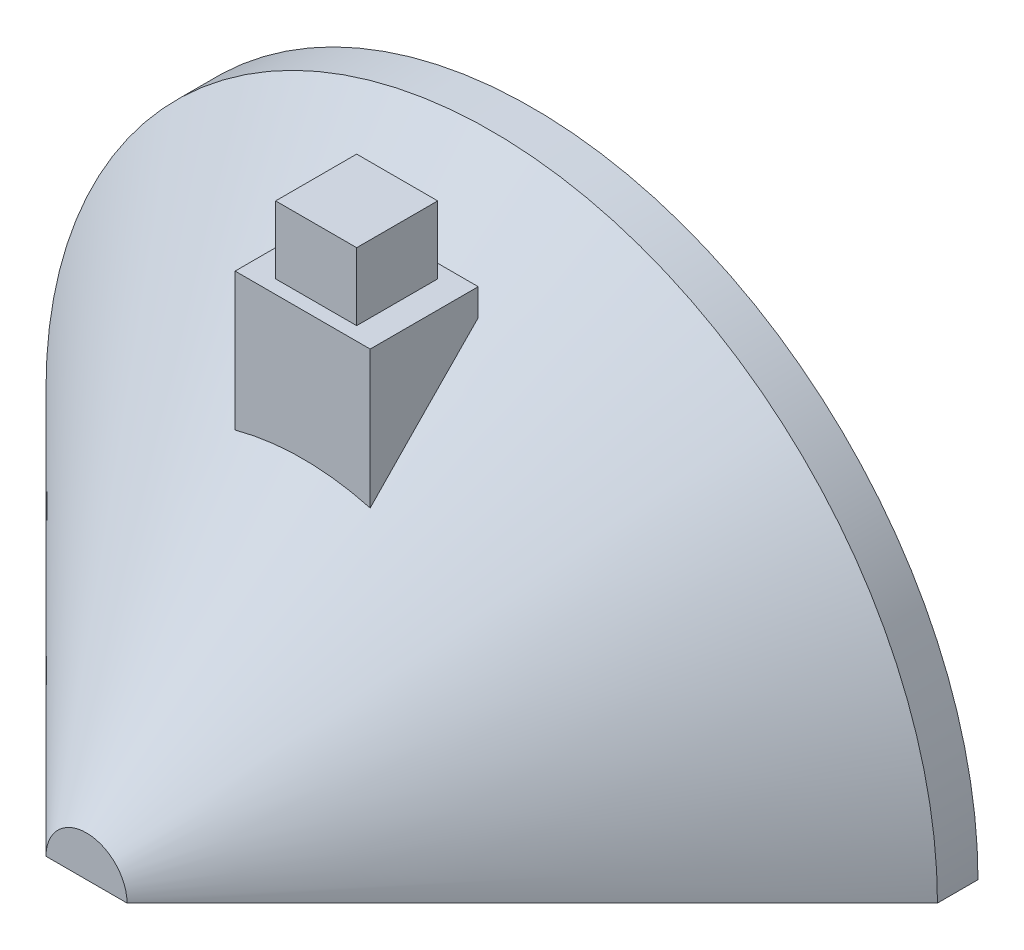
ISO-10303-21;
HEADER;
FILE_DESCRIPTION(('STEP AP214'),'2;1');
FILE_NAME('part.step','',(''),(''),'','','');
FILE_SCHEMA(('AUTOMOTIVE_DESIGN { 1 0 10303 214 1 1 1 1 }'));
ENDSEC;
DATA;
#1=APPLICATION_CONTEXT('core data for automotive mechanical design processes');
#2=APPLICATION_PROTOCOL_DEFINITION('international standard','automotive_design',2000,#1);
#3=PRODUCT_CONTEXT('',#1,'mechanical');
#4=PRODUCT('Part','Part','',(#3));
#5=PRODUCT_RELATED_PRODUCT_CATEGORY('part','',(#4));
#6=PRODUCT_DEFINITION_FORMATION('','',#4);
#7=PRODUCT_DEFINITION_CONTEXT('part definition',#1,'design');
#8=PRODUCT_DEFINITION('design','',#6,#7);
#9=PRODUCT_DEFINITION_SHAPE('','',#8);
#10=(LENGTH_UNIT() NAMED_UNIT(*) SI_UNIT(.MILLI.,.METRE.));
#11=(NAMED_UNIT(*) PLANE_ANGLE_UNIT() SI_UNIT($,.RADIAN.));
#12=(NAMED_UNIT(*) SI_UNIT($,.STERADIAN.) SOLID_ANGLE_UNIT());
#13=UNCERTAINTY_MEASURE_WITH_UNIT(LENGTH_MEASURE(1.E-05),#10,'distance_accuracy_value','');
#14=(GEOMETRIC_REPRESENTATION_CONTEXT(3) GLOBAL_UNCERTAINTY_ASSIGNED_CONTEXT((#13)) GLOBAL_UNIT_ASSIGNED_CONTEXT((#10,
#11,#12)) REPRESENTATION_CONTEXT('',''));
#15=CARTESIAN_POINT('',(0.,0.,0.));
#16=DIRECTION('',(0.,0.,1.));
#17=DIRECTION('',(1.,0.,0.));
#18=AXIS2_PLACEMENT_3D('',#15,#16,#17);
#19=CARTESIAN_POINT('',(0.,0.,-38.1));
#20=DIRECTION('',(0.,0.,-1.));
#21=DIRECTION('',(-1.,0.,0.));
#22=AXIS2_PLACEMENT_3D('',#19,#20,#21);
#23=CONICAL_SURFACE('',#22,41.91,0.785398163397448);
#24=CARTESIAN_POINT('',(0.,0.,-38.1));
#25=DIRECTION('',(0.,0.,-1.));
#26=DIRECTION('',(-1.,0.,0.));
#27=AXIS2_PLACEMENT_3D('',#24,#25,#26);
#28=CIRCLE('',#27,41.91);
#29=CARTESIAN_POINT('',(-41.91,-1.46327982910916E-13,-38.1));
#30=VERTEX_POINT('',#29);
#31=CARTESIAN_POINT('',(41.91,-1.46327982910916E-13,-38.1));
#32=VERTEX_POINT('',#31);
#33=EDGE_CURVE('E243',#30,#32,#28,.T.);
#34=ORIENTED_EDGE('',*,*,#33,.F.);
#35=DIRECTION('',(0.707106781186547,0.,0.707106781186547));
#36=VECTOR('',#35,1.);
#37=CARTESIAN_POINT('',(-41.91,-1.46327982910916E-13,-38.1));
#38=LINE('',#37,#36);
#39=CARTESIAN_POINT('',(-3.81,0.,0.));
#40=VERTEX_POINT('',#39);
#41=EDGE_CURVE('E230',#30,#40,#38,.T.);
#42=ORIENTED_EDGE('',*,*,#41,.T.);
#43=CARTESIAN_POINT('',(0.,0.,0.));
#44=DIRECTION('',(0.,0.,-1.));
#45=DIRECTION('',(-1.,0.,0.));
#46=AXIS2_PLACEMENT_3D('',#43,#44,#45);
#47=CIRCLE('',#46,3.81);
#48=CARTESIAN_POINT('',(3.81,0.,0.));
#49=VERTEX_POINT('',#48);
#50=EDGE_CURVE('E246',#40,#49,#47,.T.);
#51=ORIENTED_EDGE('',*,*,#50,.T.);
#52=DIRECTION('',(-0.707106781186547,0.,0.707106781186547));
#53=VECTOR('',#52,1.);
#54=CARTESIAN_POINT('',(41.91,-1.46327982910916E-13,-38.1));
#55=LINE('',#54,#53);
#56=EDGE_CURVE('E214',#32,#49,#55,.T.);
#57=ORIENTED_EDGE('',*,*,#56,.F.);
#58=EDGE_LOOP('',(#34,#42,#51,#57));
#59=FACE_BOUND('',#58,.T.);
#60=CARTESIAN_POINT('',(0.,0.,-20.32));
#61=DIRECTION('',(0.,0.,1.));
#62=DIRECTION('',(1.,0.,0.));
#63=AXIS2_PLACEMENT_3D('',#60,#61,#62);
#64=CIRCLE('',#63,24.13);
#65=CARTESIAN_POINT('',(-6.35,23.2794845303757,-20.32));
#66=VERTEX_POINT('',#65);
#67=CARTESIAN_POINT('',(6.35,23.2794845303757,-20.32));
#68=VERTEX_POINT('',#67);
#69=EDGE_CURVE('E61',#66,#68,#64,.F.);
#70=ORIENTED_EDGE('',*,*,#69,.F.);
#71=CARTESIAN_POINT('',(-6.35,1.44781831739966,-2.70296229685064));
#72=CARTESIAN_POINT('',(-6.35,1.70063037380408,-2.7591551997417));
#73=CARTESIAN_POINT('',(-6.35,1.95003338328599,-2.82861011091205));
#74=CARTESIAN_POINT('',(-6.35,2.4409831839826,-2.98906178464041));
#75=CARTESIAN_POINT('',(-6.35,2.68255286715164,-3.07998782526395));
#76=CARTESIAN_POINT('',(-6.35,3.15622279339293,-3.27789822967199));
#77=CARTESIAN_POINT('',(-6.35,3.38839037570752,-3.38472479079187));
#78=CARTESIAN_POINT('',(-6.35,3.73185997589738,-3.55474049026421));
#79=CARTESIAN_POINT('',(-6.35,3.84560404840172,-3.61307075444828));
#80=CARTESIAN_POINT('',(-6.35,4.07156775468318,-3.7326102977887));
#81=CARTESIAN_POINT('',(-6.35,4.18378740795518,-3.79381954008277));
#82=CARTESIAN_POINT('',(-6.35,4.51709068598885,-3.98055878221523));
#83=CARTESIAN_POINT('',(-6.35,4.73607930291173,-4.10983343301281));
#84=CARTESIAN_POINT('',(-6.35,5.16924646821573,-4.37623618799389));
#85=CARTESIAN_POINT('',(-6.35,5.38342400213568,-4.51336592725184));
#86=CARTESIAN_POINT('',(-6.35,5.80781886297028,-4.79394682052826));
#87=CARTESIAN_POINT('',(-6.35,6.01803303615147,-4.93740272851396));
#88=CARTESIAN_POINT('',(-6.35,6.43494096477158,-5.22929346457439));
#89=CARTESIAN_POINT('',(-6.35,6.64163496407014,-5.37772794562627));
#90=CARTESIAN_POINT('',(-6.35,7.05253177172607,-5.67900095619633));
#91=CARTESIAN_POINT('',(-6.35,7.25672754578679,-5.83184905669594));
#92=CARTESIAN_POINT('',(-6.35,7.66257341653958,-6.14089299760288));
#93=CARTESIAN_POINT('',(-6.35,7.86422343538842,-6.2970889399873));
#94=CARTESIAN_POINT('',(-6.35,8.46574808382686,-6.76967816041233));
#95=CARTESIAN_POINT('',(-6.35,8.86237497896674,-7.09020468542234));
#96=CARTESIAN_POINT('',(-6.35,9.66071623783298,-7.74853253247813));
#97=CARTESIAN_POINT('',(-6.35,10.0622389371087,-8.08656481835487));
#98=CARTESIAN_POINT('',(-6.35,10.8601698037552,-8.76867139108604));
#99=CARTESIAN_POINT('',(-6.35,11.2565775100933,-9.11274621606782));
#100=CARTESIAN_POINT('',(-6.35,12.0447560974404,-9.80481485592122));
#101=CARTESIAN_POINT('',(-6.35,12.4365337154975,-10.1528010140359));
#102=CARTESIAN_POINT('',(-6.35,13.0218610539503,-10.6773709306655));
#103=CARTESIAN_POINT('',(-6.35,13.2165770309706,-10.8526563499511));
#104=CARTESIAN_POINT('',(-6.35,13.6053127394153,-11.2039972830734));
#105=CARTESIAN_POINT('',(-6.35,13.7993324714562,-11.3800527962279));
#106=CARTESIAN_POINT('',(-6.35,14.4373992434899,-11.961087321857));
#107=CARTESIAN_POINT('',(-6.35,14.8801263802326,-12.3675161861072));
#108=CARTESIAN_POINT('',(-6.35,15.7630238398576,-13.1831433703615));
#109=CARTESIAN_POINT('',(-6.35,16.2031941450579,-13.592341709476));
#110=CARTESIAN_POINT('',(-6.35,17.0814961564063,-14.4129387576574));
#111=CARTESIAN_POINT('',(-6.35,17.5196278170729,-14.8243375153788));
#112=CARTESIAN_POINT('',(-6.35,18.3942259270049,-15.6489019209196));
#113=CARTESIAN_POINT('',(-6.35,18.8306923727436,-16.0620675724771));
#114=CARTESIAN_POINT('',(-6.35,20.1381320282824,-17.303786600433));
#115=CARTESIAN_POINT('',(-6.35,21.0070657107407,-18.1344872094059));
#116=CARTESIAN_POINT('',(-6.35,22.7411315871325,-19.7998184795611));
#117=CARTESIAN_POINT('',(-6.35,23.6062638289205,-20.634449090995));
#118=CARTESIAN_POINT('',(-6.35,25.3346277653886,-22.3074028337558));
#119=CARTESIAN_POINT('',(-6.35,26.197856690522,-23.1457288251256));
#120=CARTESIAN_POINT('',(-6.35,27.9222418801036,-24.8245137475987));
#121=CARTESIAN_POINT('',(-6.35,28.7833981383792,-25.6649726850388));
#122=CARTESIAN_POINT('',(-6.35,30.5040714212876,-27.3474777571352));
#123=CARTESIAN_POINT('',(-6.35,31.3635885281666,-28.1895238077032));
#124=CARTESIAN_POINT('',(-6.35,33.0813696912763,-29.874893217233));
#125=CARTESIAN_POINT('',(-6.35,33.9396337471466,-30.7182165765618));
#126=CARTESIAN_POINT('',(-6.35,36.3010414980101,-33.0412530462178));
#127=CARTESIAN_POINT('',(-6.35,37.8031545475805,-34.5220137360672));
#128=CARTESIAN_POINT('',(-6.35,40.8052744547021,-37.4857145387342));
#129=CARTESIAN_POINT('',(-6.35,42.3052812789386,-38.968654685282));
#130=CARTESIAN_POINT('',(-6.35,45.3020065444127,-41.9343755399805));
#131=CARTESIAN_POINT('',(-6.35,46.79872678154,-43.4171544338092));
#132=CARTESIAN_POINT('',(-6.35,49.7909607291435,-46.3838788872956));
#133=CARTESIAN_POINT('',(-6.35,51.2864744594904,-47.86782442691));
#134=CARTESIAN_POINT('',(-6.35,52.7815788059982,-49.3521816826003));
#135=B_SPLINE_CURVE_WITH_KNOTS('',3,(#71,#72,#73,#74,#75,#76,#77,#78,#79,#80,#81,#82,#83,#84,
#85,#86,#87,#88,#89,#90,#91,#92,#93,#94,#95,#96,#97,#98,#99,#100,#101,#102,#103,#104,#105,#106,
#107,#108,#109,#110,#111,#112,#113,#114,#115,#116,#117,#118,#119,#120,#121,#122,#123,#124,#125,
#126,#127,#128,#129,#130,#131,#132,#133,#134),.UNSPECIFIED.,.F.,.F.,(4,2,2,2,2,2,2,2,2,2,2,2,2,
2,2,2,2,2,2,2,2,2,2,2,2,2,2,2,2,2,2,4),(0.,0.775935212391134,1.54934943621371,2.31554493939615,
2.69899526635419,3.08244068497131,3.84510371017097,4.60792606833788,5.37133177800353,
6.13468438592507,6.89983936097022,7.66501767626798,9.19471080441795,10.7692430673752,
12.3439162709665,13.9159124998383,14.7018839128065,15.4878546297043,17.2908141334618,
19.0937860909718,20.8967980810422,22.6998138875275,26.306173804161,29.9124881913216,
33.5224127332208,37.1323480125208,40.74209712462,44.3518472742557,50.6796365614786,
57.0075248344417,63.3280653814893,69.6484996150279),.UNSPECIFIED.);
#136=CARTESIAN_POINT('',(-6.35,33.6969078700109,-30.48));
#137=VERTEX_POINT('',#136);
#138=EDGE_CURVE('E11',#66,#137,#135,.T.);
#139=ORIENTED_EDGE('',*,*,#138,.T.);
#140=CARTESIAN_POINT('',(0.,0.,-30.48));
#141=DIRECTION('',(0.,0.,-1.));
#142=DIRECTION('',(-1.,0.,0.));
#143=AXIS2_PLACEMENT_3D('',#140,#141,#142);
#144=CIRCLE('',#143,34.29);
#145=CARTESIAN_POINT('',(6.35,33.6969078700109,-30.48));
#146=VERTEX_POINT('',#145);
#147=EDGE_CURVE('E259',#146,#137,#144,.F.);
#148=ORIENTED_EDGE('',*,*,#147,.F.);
#149=CARTESIAN_POINT('',(6.35,1.44781831739966,-2.70296229685064));
#150=CARTESIAN_POINT('',(6.35,1.70063037380409,-2.75915519974169));
#151=CARTESIAN_POINT('',(6.35,1.95003338328599,-2.82861011091204));
#152=CARTESIAN_POINT('',(6.35,2.4409831839826,-2.98906178464041));
#153=CARTESIAN_POINT('',(6.35,2.68255286715164,-3.07998782526396));
#154=CARTESIAN_POINT('',(6.35,3.15622279339293,-3.27789822967199));
#155=CARTESIAN_POINT('',(6.35,3.38839037570752,-3.38472479079186));
#156=CARTESIAN_POINT('',(6.35,3.73185997589738,-3.55474049026422));
#157=CARTESIAN_POINT('',(6.35,3.84560404840172,-3.61307075444829));
#158=CARTESIAN_POINT('',(6.35,4.07156775468318,-3.73261029778871));
#159=CARTESIAN_POINT('',(6.35,4.18378740795518,-3.79381954008278));
#160=CARTESIAN_POINT('',(6.35,4.51709068598885,-3.98055878221523));
#161=CARTESIAN_POINT('',(6.35,4.73607930291173,-4.10983343301281));
#162=CARTESIAN_POINT('',(6.35,5.16924646821574,-4.37623618799389));
#163=CARTESIAN_POINT('',(6.35,5.38342400213568,-4.51336592725185));
#164=CARTESIAN_POINT('',(6.35,5.80781886297028,-4.79394682052827));
#165=CARTESIAN_POINT('',(6.35,6.01803303615148,-4.93740272851396));
#166=CARTESIAN_POINT('',(6.35,6.43494096477159,-5.22929346457438));
#167=CARTESIAN_POINT('',(6.35,6.64163496407015,-5.37772794562627));
#168=CARTESIAN_POINT('',(6.35,7.05253177172608,-5.67900095619634));
#169=CARTESIAN_POINT('',(6.35,7.2567275457868,-5.83184905669594));
#170=CARTESIAN_POINT('',(6.35,7.66257341653959,-6.14089299760289));
#171=CARTESIAN_POINT('',(6.35,7.86422343538842,-6.2970889399873));
#172=CARTESIAN_POINT('',(6.35,8.46574808382687,-6.76967816041233));
#173=CARTESIAN_POINT('',(6.35,8.86237497896675,-7.09020468542234));
#174=CARTESIAN_POINT('',(6.35,9.66071623783299,-7.74853253247814));
#175=CARTESIAN_POINT('',(6.35,10.0622389371087,-8.08656481835487));
#176=CARTESIAN_POINT('',(6.35,10.8601698037552,-8.76867139108605));
#177=CARTESIAN_POINT('',(6.35,11.2565775100933,-9.11274621606782));
#178=CARTESIAN_POINT('',(6.35,12.0447560974404,-9.80481485592122));
#179=CARTESIAN_POINT('',(6.35,12.4365337154975,-10.152801014036));
#180=CARTESIAN_POINT('',(6.35,13.0218610539503,-10.6773709306655));
#181=CARTESIAN_POINT('',(6.35,13.2165770309706,-10.8526563499511));
#182=CARTESIAN_POINT('',(6.35,13.6053127394153,-11.2039972830734));
#183=CARTESIAN_POINT('',(6.35,13.7993324714562,-11.3800527962279));
#184=CARTESIAN_POINT('',(6.35,14.4373992434899,-11.9610873218571));
#185=CARTESIAN_POINT('',(6.35,14.8801263802326,-12.3675161861072));
#186=CARTESIAN_POINT('',(6.35,15.7630238398576,-13.1831433703615));
#187=CARTESIAN_POINT('',(6.35,16.203194145058,-13.592341709476));
#188=CARTESIAN_POINT('',(6.35,17.0814961564063,-14.4129387576574));
#189=CARTESIAN_POINT('',(6.35,17.5196278170729,-14.8243375153788));
#190=CARTESIAN_POINT('',(6.35,18.3942259270049,-15.6489019209196));
#191=CARTESIAN_POINT('',(6.35,18.8306923727436,-16.0620675724771));
#192=CARTESIAN_POINT('',(6.35,20.1381320282824,-17.3037866004331));
#193=CARTESIAN_POINT('',(6.35,21.0070657107407,-18.1344872094059));
#194=CARTESIAN_POINT('',(6.35,22.7411315871326,-19.7998184795611));
#195=CARTESIAN_POINT('',(6.35,23.6062638289205,-20.634449090995));
#196=CARTESIAN_POINT('',(6.35,25.3346277653886,-22.3074028337558));
#197=CARTESIAN_POINT('',(6.35,26.197856690522,-23.1457288251256));
#198=CARTESIAN_POINT('',(6.35,27.9222418801036,-24.8245137475987));
#199=CARTESIAN_POINT('',(6.35,28.7833981383792,-25.6649726850388));
#200=CARTESIAN_POINT('',(6.35,30.5040714212876,-27.3474777571352));
#201=CARTESIAN_POINT('',(6.35,31.3635885281666,-28.1895238077032));
#202=CARTESIAN_POINT('',(6.35,33.0813696912763,-29.874893217233));
#203=CARTESIAN_POINT('',(6.35,33.9396337471466,-30.7182165765618));
#204=CARTESIAN_POINT('',(6.35,36.3010414980101,-33.0412530462178));
#205=CARTESIAN_POINT('',(6.35,37.8031545475805,-34.5220137360672));
#206=CARTESIAN_POINT('',(6.35,40.8052744547021,-37.4857145387342));
#207=CARTESIAN_POINT('',(6.35,42.3052812789386,-38.968654685282));
#208=CARTESIAN_POINT('',(6.35,45.3020065444127,-41.9343755399805));
#209=CARTESIAN_POINT('',(6.35,46.79872678154,-43.4171544338092));
#210=CARTESIAN_POINT('',(6.35,49.7909607291435,-46.3838788872956));
#211=CARTESIAN_POINT('',(6.35,51.2864744594904,-47.86782442691));
#212=CARTESIAN_POINT('',(6.35,52.7815788059982,-49.3521816826003));
#213=B_SPLINE_CURVE_WITH_KNOTS('',3,(#149,#150,#151,#152,#153,#154,#155,#156,#157,#158,#159,
#160,#161,#162,#163,#164,#165,#166,#167,#168,#169,#170,#171,#172,#173,#174,#175,#176,#177,#178,
#179,#180,#181,#182,#183,#184,#185,#186,#187,#188,#189,#190,#191,#192,#193,#194,#195,#196,#197,
#198,#199,#200,#201,#202,#203,#204,#205,#206,#207,#208,#209,#210,#211,#212),.UNSPECIFIED.,.F.,
.F.,(4,2,2,2,2,2,2,2,2,2,2,2,2,2,2,2,2,2,2,2,2,2,2,2,2,2,2,2,2,2,2,4),(0.,0.775935212391135,
1.54934943621371,2.31554493939615,2.69899526635419,3.08244068497131,3.84510371017097,
4.60792606833789,5.37133177800354,6.13468438592508,6.89983936097023,7.66501767626799,
9.19471080441796,10.7692430673752,12.3439162709665,13.9159124998383,14.7018839128065,
15.4878546297043,17.2908141334618,19.0937860909719,20.8967980810423,22.6998138875275,
26.306173804161,29.9124881913216,33.5224127332208,37.1323480125208,40.74209712462,
44.3518472742557,50.6796365614786,57.0075248344417,63.3280653814893,69.648499615028),.UNSPECIFIED.);
#214=EDGE_CURVE('E250',#68,#146,#213,.T.);
#215=ORIENTED_EDGE('',*,*,#214,.F.);
#216=EDGE_LOOP('',(#70,#139,#148,#215));
#217=FACE_BOUND('',#216,.T.);
#218=ADVANCED_FACE('F47',(#59,#217),#23,.T.);
#219=CARTESIAN_POINT('',(0.,0.,0.));
#220=DIRECTION('',(0.,0.,1.));
#221=DIRECTION('',(1.,0.,0.));
#222=AXIS2_PLACEMENT_3D('',#219,#220,#221);
#223=PLANE('',#222);
#224=ORIENTED_EDGE('',*,*,#50,.F.);
#225=DIRECTION('',(1.,0.,0.));
#226=VECTOR('',#225,1.);
#227=CARTESIAN_POINT('',(0.,0.,0.));
#228=LINE('',#227,#226);
#229=EDGE_CURVE('E234',#40,#49,#228,.T.);
#230=ORIENTED_EDGE('',*,*,#229,.T.);
#231=EDGE_LOOP('',(#224,#230));
#232=FACE_BOUND('',#231,.T.);
#233=ADVANCED_FACE('F49',(#232),#223,.T.);
#234=CARTESIAN_POINT('',(0.,0.,-3.81));
#235=DIRECTION('',(0.,0.,-1.));
#236=DIRECTION('',(-1.,0.,0.));
#237=AXIS2_PLACEMENT_3D('',#234,#235,#236);
#238=CYLINDRICAL_SURFACE('',#237,41.91);
#239=CARTESIAN_POINT('',(0.,0.,-41.91));
#240=DIRECTION('',(0.,0.,-1.));
#241=DIRECTION('',(-1.,0.,0.));
#242=AXIS2_PLACEMENT_3D('',#239,#240,#241);
#243=CIRCLE('',#242,41.91);
#244=CARTESIAN_POINT('',(-41.91,-1.46327982910916E-13,-41.91));
#245=VERTEX_POINT('',#244);
#246=CARTESIAN_POINT('',(41.91,-1.46327982910916E-13,-41.91));
#247=VERTEX_POINT('',#246);
#248=EDGE_CURVE('E240',#245,#247,#243,.T.);
#249=ORIENTED_EDGE('',*,*,#248,.F.);
#250=DIRECTION('',(0.,0.,1.));
#251=VECTOR('',#250,1.);
#252=CARTESIAN_POINT('',(-41.91,-1.46327982910916E-13,-38.1));
#253=LINE('',#252,#251);
#254=EDGE_CURVE('E226',#245,#30,#253,.T.);
#255=ORIENTED_EDGE('',*,*,#254,.T.);
#256=ORIENTED_EDGE('',*,*,#33,.T.);
#257=DIRECTION('',(0.,0.,1.));
#258=VECTOR('',#257,1.);
#259=CARTESIAN_POINT('',(41.91,-1.46327982910916E-13,-38.1));
#260=LINE('',#259,#258);
#261=EDGE_CURVE('E210',#247,#32,#260,.T.);
#262=ORIENTED_EDGE('',*,*,#261,.F.);
#263=EDGE_LOOP('',(#249,#255,#256,#262));
#264=FACE_BOUND('',#263,.T.);
#265=ADVANCED_FACE('F294',(#264),#238,.T.);
#266=CARTESIAN_POINT('',(-41.91,-1.46327982910916E-13,-41.91));
#267=DIRECTION('',(0.,0.,-1.));
#268=DIRECTION('',(-1.,0.,0.));
#269=AXIS2_PLACEMENT_3D('',#266,#267,#268);
#270=PLANE('',#269);
#271=CARTESIAN_POINT('',(0.,0.,-41.91));
#272=DIRECTION('',(0.,0.,-1.));
#273=DIRECTION('',(-1.,0.,0.));
#274=AXIS2_PLACEMENT_3D('',#271,#272,#273);
#275=CIRCLE('',#274,38.1);
#276=CARTESIAN_POINT('',(-38.1,-1.33025439009923E-13,-41.91));
#277=VERTEX_POINT('',#276);
#278=CARTESIAN_POINT('',(38.1,-1.33025439009923E-13,-41.91));
#279=VERTEX_POINT('',#278);
#280=EDGE_CURVE('E237',#277,#279,#275,.T.);
#281=ORIENTED_EDGE('',*,*,#280,.F.);
#282=DIRECTION('',(-1.,0.,0.));
#283=VECTOR('',#282,1.);
#284=CARTESIAN_POINT('',(-41.91,-1.46327982910916E-13,-41.91));
#285=LINE('',#284,#283);
#286=EDGE_CURVE('E222',#277,#245,#285,.T.);
#287=ORIENTED_EDGE('',*,*,#286,.T.);
#288=ORIENTED_EDGE('',*,*,#248,.T.);
#289=DIRECTION('',(1.,0.,0.));
#290=VECTOR('',#289,1.);
#291=CARTESIAN_POINT('',(41.91,-1.46327982910916E-13,-41.91));
#292=LINE('',#291,#290);
#293=EDGE_CURVE('E206',#279,#247,#292,.T.);
#294=ORIENTED_EDGE('',*,*,#293,.F.);
#295=EDGE_LOOP('',(#281,#287,#288,#294));
#296=FACE_BOUND('',#295,.T.);
#297=ADVANCED_FACE('F291',(#296),#270,.T.);
#298=CARTESIAN_POINT('',(0.,0.,-3.81));
#299=DIRECTION('',(0.,0.,-1.));
#300=DIRECTION('',(-1.,0.,0.));
#301=AXIS2_PLACEMENT_3D('',#298,#299,#300);
#302=CONICAL_SURFACE('',#301,0.,0.785398163397448);
#303=DIRECTION('',(-0.707106781186547,0.,-0.707106781186547));
#304=VECTOR('',#303,1.);
#305=CARTESIAN_POINT('',(-38.1,-1.33025439009923E-13,-41.91));
#306=LINE('',#305,#304);
#307=CARTESIAN_POINT('',(0.,0.,-3.81));
#308=VERTEX_POINT('',#307);
#309=EDGE_CURVE('E218',#308,#277,#306,.T.);
#310=ORIENTED_EDGE('',*,*,#309,.T.);
#311=ORIENTED_EDGE('',*,*,#280,.T.);
#312=DIRECTION('',(0.707106781186547,0.,-0.707106781186547));
#313=VECTOR('',#312,1.);
#314=CARTESIAN_POINT('',(38.1,-1.33025439009923E-13,-41.91));
#315=LINE('',#314,#313);
#316=EDGE_CURVE('E199',#308,#279,#315,.T.);
#317=ORIENTED_EDGE('',*,*,#316,.F.);
#318=EDGE_LOOP('',(#310,#311,#317));
#319=FACE_BOUND('',#318,.T.);
#320=ADVANCED_FACE('F287',(#319),#302,.F.);
#321=CARTESIAN_POINT('',(0.,0.,0.));
#322=DIRECTION('',(0.,-1.,0.));
#323=DIRECTION('',(0.,0.,1.));
#324=AXIS2_PLACEMENT_3D('',#321,#322,#323);
#325=PLANE('',#324);
#326=ORIENTED_EDGE('',*,*,#309,.F.);
#327=ORIENTED_EDGE('',*,*,#316,.T.);
#328=ORIENTED_EDGE('',*,*,#293,.T.);
#329=ORIENTED_EDGE('',*,*,#261,.T.);
#330=ORIENTED_EDGE('',*,*,#56,.T.);
#331=ORIENTED_EDGE('',*,*,#229,.F.);
#332=ORIENTED_EDGE('',*,*,#41,.F.);
#333=ORIENTED_EDGE('',*,*,#254,.F.);
#334=ORIENTED_EDGE('',*,*,#286,.F.);
#335=EDGE_LOOP('',(#326,#327,#328,#329,#330,#331,#332,#333,#334));
#336=FACE_BOUND('',#335,.T.);
#337=ADVANCED_FACE('F278',(#336),#325,.T.);
#338=CARTESIAN_POINT('',(-6.35,20.3199999999999,-20.32));
#339=DIRECTION('',(0.,0.,1.));
#340=DIRECTION('',(1.,0.,0.));
#341=AXIS2_PLACEMENT_3D('',#338,#339,#340);
#342=PLANE('',#341);
#343=DIRECTION('',(0.,-1.,0.));
#344=VECTOR('',#343,1.);
#345=CARTESIAN_POINT('',(-6.35,29.3189487757862,-20.32));
#346=LINE('',#345,#344);
#347=CARTESIAN_POINT('',(-6.35,36.2236502925712,-20.32));
#348=VERTEX_POINT('',#347);
#349=EDGE_CURVE('E191',#348,#66,#346,.T.);
#350=ORIENTED_EDGE('',*,*,#349,.T.);
#351=ORIENTED_EDGE('',*,*,#69,.T.);
#352=DIRECTION('',(0.,-1.,0.));
#353=VECTOR('',#352,1.);
#354=CARTESIAN_POINT('',(6.35,29.3189487757862,-20.32));
#355=LINE('',#354,#353);
#356=CARTESIAN_POINT('',(6.35,36.2236502925712,-20.32));
#357=VERTEX_POINT('',#356);
#358=EDGE_CURVE('E180',#357,#68,#355,.T.);
#359=ORIENTED_EDGE('',*,*,#358,.F.);
#360=DIRECTION('',(1.,0.,0.));
#361=VECTOR('',#360,1.);
#362=CARTESIAN_POINT('',(-6.35,36.2236502925712,-20.32));
#363=LINE('',#362,#361);
#364=EDGE_CURVE('E196',#348,#357,#363,.T.);
#365=ORIENTED_EDGE('',*,*,#364,.F.);
#366=EDGE_LOOP('',(#350,#351,#359,#365));
#367=FACE_BOUND('',#366,.T.);
#368=ADVANCED_FACE('F274',(#367),#342,.T.);
#369=CARTESIAN_POINT('',(-6.35,36.2236502925712,-30.48));
#370=DIRECTION('',(0.,1.,0.));
#371=DIRECTION('',(0.,0.,1.));
#372=AXIS2_PLACEMENT_3D('',#369,#370,#371);
#373=PLANE('',#372);
#374=DIRECTION('',(0.,0.,-1.));
#375=VECTOR('',#374,1.);
#376=CARTESIAN_POINT('',(3.81,36.2236502925712,-21.59));
#377=LINE('',#376,#375);
#378=CARTESIAN_POINT('',(3.81,36.2236502925712,-21.59));
#379=VERTEX_POINT('',#378);
#380=CARTESIAN_POINT('',(3.81,36.2236502925712,-29.21));
#381=VERTEX_POINT('',#380);
#382=EDGE_CURVE('E68',#379,#381,#377,.T.);
#383=ORIENTED_EDGE('',*,*,#382,.F.);
#384=DIRECTION('',(1.,0.,0.));
#385=VECTOR('',#384,1.);
#386=CARTESIAN_POINT('',(-3.81,36.2236502925712,-21.59));
#387=LINE('',#386,#385);
#388=CARTESIAN_POINT('',(-3.81,36.2236502925712,-21.59));
#389=VERTEX_POINT('',#388);
#390=EDGE_CURVE('E72',#389,#379,#387,.T.);
#391=ORIENTED_EDGE('',*,*,#390,.F.);
#392=DIRECTION('',(0.,0.,1.));
#393=VECTOR('',#392,1.);
#394=CARTESIAN_POINT('',(-3.81,36.2236502925712,-21.59));
#395=LINE('',#394,#393);
#396=CARTESIAN_POINT('',(-3.81,36.2236502925712,-29.21));
#397=VERTEX_POINT('',#396);
#398=EDGE_CURVE('E494',#397,#389,#395,.T.);
#399=ORIENTED_EDGE('',*,*,#398,.F.);
#400=DIRECTION('',(-1.,0.,0.));
#401=VECTOR('',#400,1.);
#402=CARTESIAN_POINT('',(-3.81,36.2236502925712,-29.21));
#403=LINE('',#402,#401);
#404=EDGE_CURVE('E504',#381,#397,#403,.T.);
#405=ORIENTED_EDGE('',*,*,#404,.F.);
#406=EDGE_LOOP('',(#383,#391,#399,#405));
#407=FACE_BOUND('',#406,.T.);
#408=ORIENTED_EDGE('',*,*,#364,.T.);
#409=DIRECTION('',(0.,0.,1.));
#410=VECTOR('',#409,1.);
#411=CARTESIAN_POINT('',(6.35,36.2236502925712,-30.48));
#412=LINE('',#411,#410);
#413=CARTESIAN_POINT('',(6.35,36.2236502925712,-30.48));
#414=VERTEX_POINT('',#413);
#415=EDGE_CURVE('E171',#414,#357,#412,.T.);
#416=ORIENTED_EDGE('',*,*,#415,.F.);
#417=DIRECTION('',(1.,0.,0.));
#418=VECTOR('',#417,1.);
#419=CARTESIAN_POINT('',(-6.35,36.2236502925712,-30.48));
#420=LINE('',#419,#418);
#421=CARTESIAN_POINT('',(-6.35,36.2236502925712,-30.48));
#422=VERTEX_POINT('',#421);
#423=EDGE_CURVE('E195',#422,#414,#420,.T.);
#424=ORIENTED_EDGE('',*,*,#423,.F.);
#425=DIRECTION('',(0.,0.,1.));
#426=VECTOR('',#425,1.);
#427=CARTESIAN_POINT('',(-6.35,36.2236502925712,-30.48));
#428=LINE('',#427,#426);
#429=EDGE_CURVE('E187',#422,#348,#428,.T.);
#430=ORIENTED_EDGE('',*,*,#429,.T.);
#431=EDGE_LOOP('',(#408,#416,#424,#430));
#432=FACE_BOUND('',#431,.T.);
#433=ADVANCED_FACE('F277',(#407,#432),#373,.T.);
#434=CARTESIAN_POINT('',(-6.35,30.4799999999999,-30.48));
#435=DIRECTION('',(0.,0.,-1.));
#436=DIRECTION('',(-1.,0.,0.));
#437=AXIS2_PLACEMENT_3D('',#434,#435,#436);
#438=PLANE('',#437);
#439=DIRECTION('',(0.,1.,0.));
#440=VECTOR('',#439,1.);
#441=CARTESIAN_POINT('',(6.35,30.4799999999999,-30.48));
#442=LINE('',#441,#440);
#443=EDGE_CURVE('E167',#146,#414,#442,.T.);
#444=ORIENTED_EDGE('',*,*,#443,.F.);
#445=ORIENTED_EDGE('',*,*,#147,.T.);
#446=DIRECTION('',(0.,1.,0.));
#447=VECTOR('',#446,1.);
#448=CARTESIAN_POINT('',(-6.35,30.4799999999999,-30.48));
#449=LINE('',#448,#447);
#450=EDGE_CURVE('E184',#137,#422,#449,.T.);
#451=ORIENTED_EDGE('',*,*,#450,.T.);
#452=ORIENTED_EDGE('',*,*,#423,.T.);
#453=EDGE_LOOP('',(#444,#445,#451,#452));
#454=FACE_BOUND('',#453,.T.);
#455=ADVANCED_FACE('F272',(#454),#438,.T.);
#456=CARTESIAN_POINT('',(-6.35,0.,0.));
#457=DIRECTION('',(1.,0.,0.));
#458=DIRECTION('',(0.,0.,-1.));
#459=AXIS2_PLACEMENT_3D('',#456,#457,#458);
#460=PLANE('',#459);
#461=ORIENTED_EDGE('',*,*,#138,.F.);
#462=ORIENTED_EDGE('',*,*,#349,.F.);
#463=ORIENTED_EDGE('',*,*,#429,.F.);
#464=ORIENTED_EDGE('',*,*,#450,.F.);
#465=EDGE_LOOP('',(#461,#462,#463,#464));
#466=FACE_BOUND('',#465,.T.);
#467=ADVANCED_FACE('F266',(#466),#460,.F.);
#468=CARTESIAN_POINT('',(6.35,0.,0.));
#469=DIRECTION('',(1.,0.,0.));
#470=DIRECTION('',(0.,0.,-1.));
#471=AXIS2_PLACEMENT_3D('',#468,#469,#470);
#472=PLANE('',#471);
#473=ORIENTED_EDGE('',*,*,#358,.T.);
#474=ORIENTED_EDGE('',*,*,#214,.T.);
#475=ORIENTED_EDGE('',*,*,#443,.T.);
#476=ORIENTED_EDGE('',*,*,#415,.T.);
#477=EDGE_LOOP('',(#473,#474,#475,#476));
#478=FACE_BOUND('',#477,.T.);
#479=ADVANCED_FACE('F262',(#478),#472,.T.);
#480=CARTESIAN_POINT('',(3.81,42.5736502925712,-21.59));
#481=DIRECTION('',(-1.,0.,0.));
#482=DIRECTION('',(0.,0.,1.));
#483=AXIS2_PLACEMENT_3D('',#480,#481,#482);
#484=PLANE('',#483);
#485=ORIENTED_EDGE('',*,*,#382,.T.);
#486=DIRECTION('',(0.,-1.,0.));
#487=VECTOR('',#486,1.);
#488=CARTESIAN_POINT('',(3.81,42.5736502925712,-29.21));
#489=LINE('',#488,#487);
#490=CARTESIAN_POINT('',(3.81,42.5736502925712,-29.21));
#491=VERTEX_POINT('',#490);
#492=EDGE_CURVE('E147',#491,#381,#489,.T.);
#493=ORIENTED_EDGE('',*,*,#492,.F.);
#494=DIRECTION('',(0.,0.,-1.));
#495=VECTOR('',#494,1.);
#496=CARTESIAN_POINT('',(3.81,42.5736502925712,-21.59));
#497=LINE('',#496,#495);
#498=CARTESIAN_POINT('',(3.81,42.5736502925712,-21.59));
#499=VERTEX_POINT('',#498);
#500=EDGE_CURVE('E154',#499,#491,#497,.T.);
#501=ORIENTED_EDGE('',*,*,#500,.F.);
#502=DIRECTION('',(0.,-1.,0.));
#503=VECTOR('',#502,1.);
#504=CARTESIAN_POINT('',(3.81,42.5736502925712,-21.59));
#505=LINE('',#504,#503);
#506=EDGE_CURVE('E491',#499,#379,#505,.T.);
#507=ORIENTED_EDGE('',*,*,#506,.T.);
#508=EDGE_LOOP('',(#485,#493,#501,#507));
#509=FACE_BOUND('',#508,.T.);
#510=ADVANCED_FACE('F165',(#509),#484,.F.);
#511=CARTESIAN_POINT('',(-3.81,42.5736502925712,-29.21));
#512=DIRECTION('',(0.,0.,1.));
#513=DIRECTION('',(1.,0.,0.));
#514=AXIS2_PLACEMENT_3D('',#511,#512,#513);
#515=PLANE('',#514);
#516=ORIENTED_EDGE('',*,*,#404,.T.);
#517=DIRECTION('',(0.,-1.,0.));
#518=VECTOR('',#517,1.);
#519=CARTESIAN_POINT('',(-3.81,42.5736502925712,-29.21));
#520=LINE('',#519,#518);
#521=CARTESIAN_POINT('',(-3.81,42.5736502925712,-29.21));
#522=VERTEX_POINT('',#521);
#523=EDGE_CURVE('E149',#522,#397,#520,.T.);
#524=ORIENTED_EDGE('',*,*,#523,.F.);
#525=DIRECTION('',(-1.,0.,0.));
#526=VECTOR('',#525,1.);
#527=CARTESIAN_POINT('',(-3.81,42.5736502925712,-29.21));
#528=LINE('',#527,#526);
#529=EDGE_CURVE('E142',#491,#522,#528,.T.);
#530=ORIENTED_EDGE('',*,*,#529,.F.);
#531=ORIENTED_EDGE('',*,*,#492,.T.);
#532=EDGE_LOOP('',(#516,#524,#530,#531));
#533=FACE_BOUND('',#532,.T.);
#534=ADVANCED_FACE('F145',(#533),#515,.F.);
#535=CARTESIAN_POINT('',(-3.81,42.5736502925712,-21.59));
#536=DIRECTION('',(1.,0.,0.));
#537=DIRECTION('',(0.,0.,-1.));
#538=AXIS2_PLACEMENT_3D('',#535,#536,#537);
#539=PLANE('',#538);
#540=ORIENTED_EDGE('',*,*,#398,.T.);
#541=DIRECTION('',(0.,-1.,0.));
#542=VECTOR('',#541,1.);
#543=CARTESIAN_POINT('',(-3.81,42.5736502925712,-21.59));
#544=LINE('',#543,#542);
#545=CARTESIAN_POINT('',(-3.81,42.5736502925712,-21.59));
#546=VERTEX_POINT('',#545);
#547=EDGE_CURVE('E173',#546,#389,#544,.T.);
#548=ORIENTED_EDGE('',*,*,#547,.F.);
#549=DIRECTION('',(0.,0.,1.));
#550=VECTOR('',#549,1.);
#551=CARTESIAN_POINT('',(-3.81,42.5736502925712,-21.59));
#552=LINE('',#551,#550);
#553=EDGE_CURVE('E153',#522,#546,#552,.T.);
#554=ORIENTED_EDGE('',*,*,#553,.F.);
#555=ORIENTED_EDGE('',*,*,#523,.T.);
#556=EDGE_LOOP('',(#540,#548,#554,#555));
#557=FACE_BOUND('',#556,.T.);
#558=ADVANCED_FACE('F359',(#557),#539,.F.);
#559=CARTESIAN_POINT('',(-3.81,42.5736502925712,-21.59));
#560=DIRECTION('',(0.,0.,-1.));
#561=DIRECTION('',(-1.,0.,0.));
#562=AXIS2_PLACEMENT_3D('',#559,#560,#561);
#563=PLANE('',#562);
#564=ORIENTED_EDGE('',*,*,#390,.T.);
#565=ORIENTED_EDGE('',*,*,#506,.F.);
#566=DIRECTION('',(1.,0.,0.));
#567=VECTOR('',#566,1.);
#568=CARTESIAN_POINT('',(-3.81,42.5736502925712,-21.59));
#569=LINE('',#568,#567);
#570=EDGE_CURVE('E159',#546,#499,#569,.T.);
#571=ORIENTED_EDGE('',*,*,#570,.F.);
#572=ORIENTED_EDGE('',*,*,#547,.T.);
#573=EDGE_LOOP('',(#564,#565,#571,#572));
#574=FACE_BOUND('',#573,.T.);
#575=ADVANCED_FACE('F365',(#574),#563,.F.);
#576=CARTESIAN_POINT('',(0.,42.5736502925712,0.));
#577=DIRECTION('',(0.,-1.,0.));
#578=DIRECTION('',(0.,0.,-1.));
#579=AXIS2_PLACEMENT_3D('',#576,#577,#578);
#580=PLANE('',#579);
#581=ORIENTED_EDGE('',*,*,#500,.T.);
#582=ORIENTED_EDGE('',*,*,#529,.T.);
#583=ORIENTED_EDGE('',*,*,#553,.T.);
#584=ORIENTED_EDGE('',*,*,#570,.T.);
#585=EDGE_LOOP('',(#581,#582,#583,#584));
#586=FACE_BOUND('',#585,.T.);
#587=ADVANCED_FACE('F157',(#586),#580,.F.);
#588=CLOSED_SHELL('',(#218,#233,#265,#297,#320,#337,#368,#433,#455,#467,#479,#510,#534,#558,
#575,#587));
#589=MANIFOLD_SOLID_BREP('B2',#588);
#590=ADVANCED_BREP_SHAPE_REPRESENTATION('',(#18,#589),#14);
#591=SHAPE_DEFINITION_REPRESENTATION(#9,#590);
ENDSEC;
END-ISO-10303-21;
